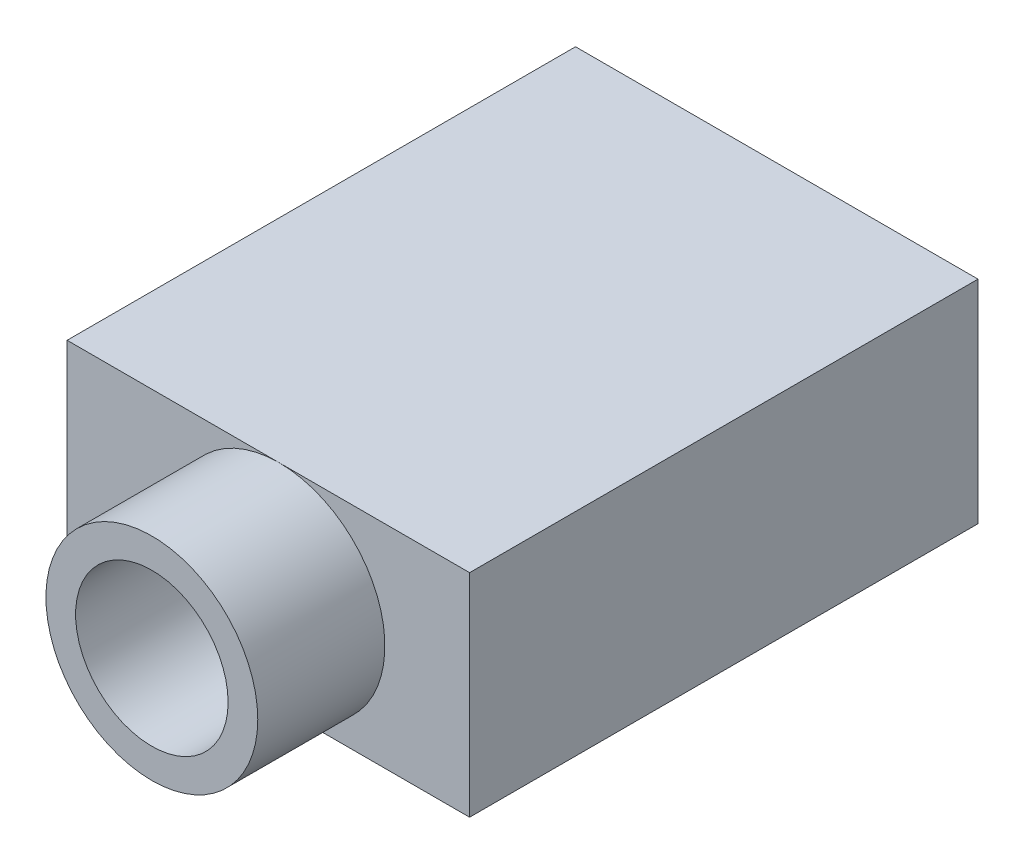
ISO-10303-21;
HEADER;
FILE_DESCRIPTION(('STEP AP214'),'2;1');
FILE_NAME('part.step','',(''),(''),'','','');
FILE_SCHEMA(('AUTOMOTIVE_DESIGN { 1 0 10303 214 1 1 1 1 }'));
ENDSEC;
DATA;
#1=APPLICATION_CONTEXT('core data for automotive mechanical design processes');
#2=APPLICATION_PROTOCOL_DEFINITION('international standard','automotive_design',2000,#1);
#3=PRODUCT_CONTEXT('',#1,'mechanical');
#4=PRODUCT('Part','Part','',(#3));
#5=PRODUCT_RELATED_PRODUCT_CATEGORY('part','',(#4));
#6=PRODUCT_DEFINITION_FORMATION('','',#4);
#7=PRODUCT_DEFINITION_CONTEXT('part definition',#1,'design');
#8=PRODUCT_DEFINITION('design','',#6,#7);
#9=PRODUCT_DEFINITION_SHAPE('','',#8);
#10=(LENGTH_UNIT() NAMED_UNIT(*) SI_UNIT(.MILLI.,.METRE.));
#11=(NAMED_UNIT(*) PLANE_ANGLE_UNIT() SI_UNIT($,.RADIAN.));
#12=(NAMED_UNIT(*) SI_UNIT($,.STERADIAN.) SOLID_ANGLE_UNIT());
#13=UNCERTAINTY_MEASURE_WITH_UNIT(LENGTH_MEASURE(1.E-05),#10,'distance_accuracy_value','');
#14=(GEOMETRIC_REPRESENTATION_CONTEXT(3) GLOBAL_UNCERTAINTY_ASSIGNED_CONTEXT((#13)) GLOBAL_UNIT_ASSIGNED_CONTEXT((#10,
#11,#12)) REPRESENTATION_CONTEXT('',''));
#15=CARTESIAN_POINT('',(0.,0.,0.));
#16=DIRECTION('',(0.,0.,1.));
#17=DIRECTION('',(1.,0.,0.));
#18=AXIS2_PLACEMENT_3D('',#15,#16,#17);
#19=CARTESIAN_POINT('',(0.,0.,0.));
#20=DIRECTION('',(0.,-1.,0.));
#21=DIRECTION('',(0.,0.,-1.));
#22=AXIS2_PLACEMENT_3D('',#19,#20,#21);
#23=PLANE('',#22);
#24=CARTESIAN_POINT('',(5.,0.,-3.));
#25=DIRECTION('',(0.,-1.,0.));
#26=DIRECTION('',(0.,0.,-1.));
#27=AXIS2_PLACEMENT_3D('',#24,#25,#26);
#28=CIRCLE('',#27,0.8);
#29=CARTESIAN_POINT('',(5.,0.,-3.8));
#30=VERTEX_POINT('',#29);
#31=EDGE_CURVE('E185',#30,#30,#28,.T.);
#32=ORIENTED_EDGE('',*,*,#31,.F.);
#33=EDGE_LOOP('',(#32));
#34=FACE_BOUND('',#33,.T.);
#35=DIRECTION('',(0.,0.,1.));
#36=VECTOR('',#35,1.);
#37=CARTESIAN_POINT('',(0.,0.,0.));
#38=LINE('',#37,#36);
#39=CARTESIAN_POINT('',(0.,0.,-12.));
#40=VERTEX_POINT('',#39);
#41=CARTESIAN_POINT('',(0.,0.,0.));
#42=VERTEX_POINT('',#41);
#43=EDGE_CURVE('E160',#40,#42,#38,.T.);
#44=ORIENTED_EDGE('',*,*,#43,.F.);
#45=DIRECTION('',(-1.,0.,0.));
#46=VECTOR('',#45,1.);
#47=CARTESIAN_POINT('',(0.,0.,-12.));
#48=LINE('',#47,#46);
#49=CARTESIAN_POINT('',(9.5,0.,-12.));
#50=VERTEX_POINT('',#49);
#51=EDGE_CURVE('E79',#50,#40,#48,.T.);
#52=ORIENTED_EDGE('',*,*,#51,.F.);
#53=DIRECTION('',(0.,0.,-1.));
#54=VECTOR('',#53,1.);
#55=CARTESIAN_POINT('',(9.5,0.,0.));
#56=LINE('',#55,#54);
#57=CARTESIAN_POINT('',(9.5,0.,0.));
#58=VERTEX_POINT('',#57);
#59=EDGE_CURVE('E170',#58,#50,#56,.T.);
#60=ORIENTED_EDGE('',*,*,#59,.F.);
#61=DIRECTION('',(1.,0.,0.));
#62=VECTOR('',#61,1.);
#63=CARTESIAN_POINT('',(0.,0.,0.));
#64=LINE('',#63,#62);
#65=CARTESIAN_POINT('',(5.,0.,0.));
#66=VERTEX_POINT('',#65);
#67=EDGE_CURVE('E162',#66,#58,#64,.T.);
#68=ORIENTED_EDGE('',*,*,#67,.F.);
#69=EDGE_CURVE('E105',#42,#66,#64,.T.);
#70=ORIENTED_EDGE('',*,*,#69,.F.);
#71=EDGE_LOOP('',(#44,#52,#60,#68,#70));
#72=FACE_BOUND('',#71,.T.);
#73=CARTESIAN_POINT('',(5.,0.,-9.));
#74=DIRECTION('',(0.,-1.,0.));
#75=DIRECTION('',(0.,0.,-1.));
#76=AXIS2_PLACEMENT_3D('',#73,#74,#75);
#77=CIRCLE('',#76,0.8);
#78=CARTESIAN_POINT('',(5.,0.,-9.8));
#79=VERTEX_POINT('',#78);
#80=EDGE_CURVE('E180',#79,#79,#77,.T.);
#81=ORIENTED_EDGE('',*,*,#80,.F.);
#82=EDGE_LOOP('',(#81));
#83=FACE_BOUND('',#82,.T.);
#84=ADVANCED_FACE('F35',(#34,#72,#83),#23,.T.);
#85=CARTESIAN_POINT('',(0.,5.,0.));
#86=DIRECTION('',(0.,0.,-1.));
#87=DIRECTION('',(-1.,0.,0.));
#88=AXIS2_PLACEMENT_3D('',#85,#86,#87);
#89=PLANE('',#88);
#90=CARTESIAN_POINT('',(5.,2.5,0.));
#91=DIRECTION('',(0.,0.,1.));
#92=DIRECTION('',(1.,0.,0.));
#93=AXIS2_PLACEMENT_3D('',#90,#91,#92);
#94=CIRCLE('',#93,2.5);
#95=CARTESIAN_POINT('',(5.,5.,0.));
#96=VERTEX_POINT('',#95);
#97=EDGE_CURVE('E45',#96,#66,#94,.T.);
#98=ORIENTED_EDGE('',*,*,#97,.F.);
#99=DIRECTION('',(1.,0.,0.));
#100=VECTOR('',#99,1.);
#101=CARTESIAN_POINT('',(0.,5.,0.));
#102=LINE('',#101,#100);
#103=CARTESIAN_POINT('',(0.,5.,0.));
#104=VERTEX_POINT('',#103);
#105=EDGE_CURVE('E87',#104,#96,#102,.T.);
#106=ORIENTED_EDGE('',*,*,#105,.F.);
#107=DIRECTION('',(0.,-1.,0.));
#108=VECTOR('',#107,1.);
#109=CARTESIAN_POINT('',(0.,5.,0.));
#110=LINE('',#109,#108);
#111=EDGE_CURVE('E39',#104,#42,#110,.T.);
#112=ORIENTED_EDGE('',*,*,#111,.T.);
#113=ORIENTED_EDGE('',*,*,#69,.T.);
#114=EDGE_LOOP('',(#98,#106,#112,#113));
#115=FACE_BOUND('',#114,.T.);
#116=ADVANCED_FACE('F104',(#115),#89,.F.);
#117=EDGE_CURVE('E11',#66,#96,#94,.T.);
#118=ORIENTED_EDGE('',*,*,#117,.F.);
#119=ORIENTED_EDGE('',*,*,#67,.T.);
#120=DIRECTION('',(0.,-1.,0.));
#121=VECTOR('',#120,1.);
#122=CARTESIAN_POINT('',(9.5,5.,0.));
#123=LINE('',#122,#121);
#124=CARTESIAN_POINT('',(9.5,5.,0.));
#125=VERTEX_POINT('',#124);
#126=EDGE_CURVE('E100',#125,#58,#123,.T.);
#127=ORIENTED_EDGE('',*,*,#126,.F.);
#128=EDGE_CURVE('E91',#96,#125,#102,.T.);
#129=ORIENTED_EDGE('',*,*,#128,.F.);
#130=EDGE_LOOP('',(#118,#119,#127,#129));
#131=FACE_BOUND('',#130,.T.);
#132=ADVANCED_FACE('F98',(#131),#89,.F.);
#133=CARTESIAN_POINT('',(0.,5.,0.));
#134=DIRECTION('',(1.,0.,0.));
#135=DIRECTION('',(0.,0.,-1.));
#136=AXIS2_PLACEMENT_3D('',#133,#134,#135);
#137=PLANE('',#136);
#138=ORIENTED_EDGE('',*,*,#43,.T.);
#139=ORIENTED_EDGE('',*,*,#111,.F.);
#140=DIRECTION('',(0.,0.,1.));
#141=VECTOR('',#140,1.);
#142=CARTESIAN_POINT('',(0.,5.,0.));
#143=LINE('',#142,#141);
#144=CARTESIAN_POINT('',(0.,5.,-12.));
#145=VERTEX_POINT('',#144);
#146=EDGE_CURVE('E94',#145,#104,#143,.T.);
#147=ORIENTED_EDGE('',*,*,#146,.F.);
#148=DIRECTION('',(0.,-1.,0.));
#149=VECTOR('',#148,1.);
#150=CARTESIAN_POINT('',(0.,5.,-12.));
#151=LINE('',#150,#149);
#152=EDGE_CURVE('E161',#145,#40,#151,.T.);
#153=ORIENTED_EDGE('',*,*,#152,.T.);
#154=EDGE_LOOP('',(#138,#139,#147,#153));
#155=FACE_BOUND('',#154,.T.);
#156=ADVANCED_FACE('F37',(#155),#137,.F.);
#157=CARTESIAN_POINT('',(9.5,5.,0.));
#158=DIRECTION('',(-1.,0.,0.));
#159=DIRECTION('',(0.,0.,1.));
#160=AXIS2_PLACEMENT_3D('',#157,#158,#159);
#161=PLANE('',#160);
#162=ORIENTED_EDGE('',*,*,#59,.T.);
#163=DIRECTION('',(0.,-1.,0.));
#164=VECTOR('',#163,1.);
#165=CARTESIAN_POINT('',(9.5,5.,-12.));
#166=LINE('',#165,#164);
#167=CARTESIAN_POINT('',(9.5,5.,-12.));
#168=VERTEX_POINT('',#167);
#169=EDGE_CURVE('E174',#168,#50,#166,.T.);
#170=ORIENTED_EDGE('',*,*,#169,.F.);
#171=DIRECTION('',(0.,0.,-1.));
#172=VECTOR('',#171,1.);
#173=CARTESIAN_POINT('',(9.5,5.,0.));
#174=LINE('',#173,#172);
#175=EDGE_CURVE('E96',#125,#168,#174,.T.);
#176=ORIENTED_EDGE('',*,*,#175,.F.);
#177=ORIENTED_EDGE('',*,*,#126,.T.);
#178=EDGE_LOOP('',(#162,#170,#176,#177));
#179=FACE_BOUND('',#178,.T.);
#180=ADVANCED_FACE('F138',(#179),#161,.F.);
#181=CARTESIAN_POINT('',(0.,5.,-12.));
#182=DIRECTION('',(0.,0.,1.));
#183=DIRECTION('',(1.,0.,0.));
#184=AXIS2_PLACEMENT_3D('',#181,#182,#183);
#185=PLANE('',#184);
#186=ORIENTED_EDGE('',*,*,#51,.T.);
#187=ORIENTED_EDGE('',*,*,#152,.F.);
#188=DIRECTION('',(-1.,0.,0.));
#189=VECTOR('',#188,1.);
#190=CARTESIAN_POINT('',(0.,5.,-12.));
#191=LINE('',#190,#189);
#192=EDGE_CURVE('E59',#168,#145,#191,.T.);
#193=ORIENTED_EDGE('',*,*,#192,.F.);
#194=ORIENTED_EDGE('',*,*,#169,.T.);
#195=EDGE_LOOP('',(#186,#187,#193,#194));
#196=FACE_BOUND('',#195,.T.);
#197=ADVANCED_FACE('F135',(#196),#185,.F.);
#198=CARTESIAN_POINT('',(0.,5.,0.));
#199=DIRECTION('',(0.,-1.,0.));
#200=DIRECTION('',(0.,0.,-1.));
#201=AXIS2_PLACEMENT_3D('',#198,#199,#200);
#202=PLANE('',#201);
#203=ORIENTED_EDGE('',*,*,#146,.T.);
#204=ORIENTED_EDGE('',*,*,#105,.T.);
#205=ORIENTED_EDGE('',*,*,#128,.T.);
#206=ORIENTED_EDGE('',*,*,#175,.T.);
#207=ORIENTED_EDGE('',*,*,#192,.T.);
#208=EDGE_LOOP('',(#203,#204,#205,#206,#207));
#209=FACE_BOUND('',#208,.T.);
#210=ADVANCED_FACE('F90',(#209),#202,.F.);
#211=CARTESIAN_POINT('',(5.,2.5,3.));
#212=DIRECTION('',(0.,0.,1.));
#213=DIRECTION('',(1.,0.,0.));
#214=AXIS2_PLACEMENT_3D('',#211,#212,#213);
#215=PLANE('',#214);
#216=CARTESIAN_POINT('',(5.,2.5,3.));
#217=DIRECTION('',(0.,0.,1.));
#218=DIRECTION('',(1.,0.,0.));
#219=AXIS2_PLACEMENT_3D('',#216,#217,#218);
#220=CIRCLE('',#219,2.5);
#221=CARTESIAN_POINT('',(7.5,2.5,3.));
#222=VERTEX_POINT('',#221);
#223=EDGE_CURVE('E107',#222,#222,#220,.T.);
#224=ORIENTED_EDGE('',*,*,#223,.T.);
#225=EDGE_LOOP('',(#224));
#226=FACE_BOUND('',#225,.T.);
#227=CARTESIAN_POINT('',(5.,2.5,3.));
#228=DIRECTION('',(0.,0.,1.));
#229=DIRECTION('',(1.,0.,0.));
#230=AXIS2_PLACEMENT_3D('',#227,#228,#229);
#231=CIRCLE('',#230,1.8);
#232=CARTESIAN_POINT('',(6.8,2.5,3.));
#233=VERTEX_POINT('',#232);
#234=EDGE_CURVE('E108',#233,#233,#231,.T.);
#235=ORIENTED_EDGE('',*,*,#234,.F.);
#236=EDGE_LOOP('',(#235));
#237=FACE_BOUND('',#236,.T.);
#238=ADVANCED_FACE('F112',(#226,#237),#215,.T.);
#239=CARTESIAN_POINT('',(5.,2.5,3.));
#240=DIRECTION('',(0.,0.,-1.));
#241=DIRECTION('',(-1.,0.,0.));
#242=AXIS2_PLACEMENT_3D('',#239,#240,#241);
#243=CYLINDRICAL_SURFACE('',#242,2.5);
#244=ORIENTED_EDGE('',*,*,#223,.F.);
#245=EDGE_LOOP('',(#244));
#246=FACE_BOUND('',#245,.T.);
#247=ORIENTED_EDGE('',*,*,#97,.T.);
#248=ORIENTED_EDGE('',*,*,#117,.T.);
#249=EDGE_LOOP('',(#247,#248));
#250=FACE_BOUND('',#249,.T.);
#251=ADVANCED_FACE('F109',(#246,#250),#243,.T.);
#252=CARTESIAN_POINT('',(5.,2.5,3.));
#253=DIRECTION('',(0.,0.,-1.));
#254=DIRECTION('',(-1.,0.,0.));
#255=AXIS2_PLACEMENT_3D('',#252,#253,#254);
#256=CYLINDRICAL_SURFACE('',#255,1.8);
#257=ORIENTED_EDGE('',*,*,#234,.T.);
#258=EDGE_LOOP('',(#257));
#259=FACE_BOUND('',#258,.T.);
#260=CARTESIAN_POINT('',(5.,2.5,0.));
#261=DIRECTION('',(0.,0.,1.));
#262=DIRECTION('',(1.,0.,0.));
#263=AXIS2_PLACEMENT_3D('',#260,#261,#262);
#264=CIRCLE('',#263,1.8);
#265=CARTESIAN_POINT('',(6.8,2.5,0.));
#266=VERTEX_POINT('',#265);
#267=EDGE_CURVE('E191',#266,#266,#264,.T.);
#268=ORIENTED_EDGE('',*,*,#267,.F.);
#269=EDGE_LOOP('',(#268));
#270=FACE_BOUND('',#269,.T.);
#271=ADVANCED_FACE('F111',(#259,#270),#256,.F.);
#272=ORIENTED_EDGE('',*,*,#267,.T.);
#273=EDGE_LOOP('',(#272));
#274=FACE_BOUND('',#273,.T.);
#275=ADVANCED_FACE('F119',(#274),#89,.F.);
#276=CARTESIAN_POINT('',(5.,-1.,-3.));
#277=DIRECTION('',(0.,1.,0.));
#278=DIRECTION('',(0.,0.,1.));
#279=AXIS2_PLACEMENT_3D('',#276,#277,#278);
#280=CYLINDRICAL_SURFACE('',#279,0.8);
#281=CARTESIAN_POINT('',(5.,-1.,-3.));
#282=DIRECTION('',(0.,-1.,0.));
#283=DIRECTION('',(0.,0.,-1.));
#284=AXIS2_PLACEMENT_3D('',#281,#282,#283);
#285=CIRCLE('',#284,0.8);
#286=CARTESIAN_POINT('',(5.,-1.,-3.8));
#287=VERTEX_POINT('',#286);
#288=EDGE_CURVE('E188',#287,#287,#285,.T.);
#289=ORIENTED_EDGE('',*,*,#288,.F.);
#290=EDGE_LOOP('',(#289));
#291=FACE_BOUND('',#290,.T.);
#292=ORIENTED_EDGE('',*,*,#31,.T.);
#293=EDGE_LOOP('',(#292));
#294=FACE_BOUND('',#293,.T.);
#295=ADVANCED_FACE('F142',(#291,#294),#280,.T.);
#296=CARTESIAN_POINT('',(5.,-1.,-3.));
#297=DIRECTION('',(0.,-1.,0.));
#298=DIRECTION('',(0.,0.,-1.));
#299=AXIS2_PLACEMENT_3D('',#296,#297,#298);
#300=PLANE('',#299);
#301=ORIENTED_EDGE('',*,*,#288,.T.);
#302=EDGE_LOOP('',(#301));
#303=FACE_BOUND('',#302,.T.);
#304=ADVANCED_FACE('F147',(#303),#300,.T.);
#305=CARTESIAN_POINT('',(5.,-1.,-9.));
#306=DIRECTION('',(0.,1.,0.));
#307=DIRECTION('',(0.,0.,1.));
#308=AXIS2_PLACEMENT_3D('',#305,#306,#307);
#309=CYLINDRICAL_SURFACE('',#308,0.8);
#310=CARTESIAN_POINT('',(5.,-1.,-9.));
#311=DIRECTION('',(0.,-1.,0.));
#312=DIRECTION('',(0.,0.,-1.));
#313=AXIS2_PLACEMENT_3D('',#310,#311,#312);
#314=CIRCLE('',#313,0.8);
#315=CARTESIAN_POINT('',(5.,-1.,-9.8));
#316=VERTEX_POINT('',#315);
#317=EDGE_CURVE('E182',#316,#316,#314,.T.);
#318=ORIENTED_EDGE('',*,*,#317,.F.);
#319=EDGE_LOOP('',(#318));
#320=FACE_BOUND('',#319,.T.);
#321=ORIENTED_EDGE('',*,*,#80,.T.);
#322=EDGE_LOOP('',(#321));
#323=FACE_BOUND('',#322,.T.);
#324=ADVANCED_FACE('F205',(#320,#323),#309,.T.);
#325=CARTESIAN_POINT('',(5.,-1.,-9.));
#326=DIRECTION('',(0.,-1.,0.));
#327=DIRECTION('',(0.,0.,-1.));
#328=AXIS2_PLACEMENT_3D('',#325,#326,#327);
#329=PLANE('',#328);
#330=ORIENTED_EDGE('',*,*,#317,.T.);
#331=EDGE_LOOP('',(#330));
#332=FACE_BOUND('',#331,.T.);
#333=ADVANCED_FACE('F210',(#332),#329,.T.);
#334=CLOSED_SHELL('',(#84,#116,#132,#156,#180,#197,#210,#238,#251,#271,#275,#295,#304,#324,#333));
#335=MANIFOLD_SOLID_BREP('B2',#334);
#336=ADVANCED_BREP_SHAPE_REPRESENTATION('',(#18,#335),#14);
#337=SHAPE_DEFINITION_REPRESENTATION(#9,#336);
ENDSEC;
END-ISO-10303-21;
